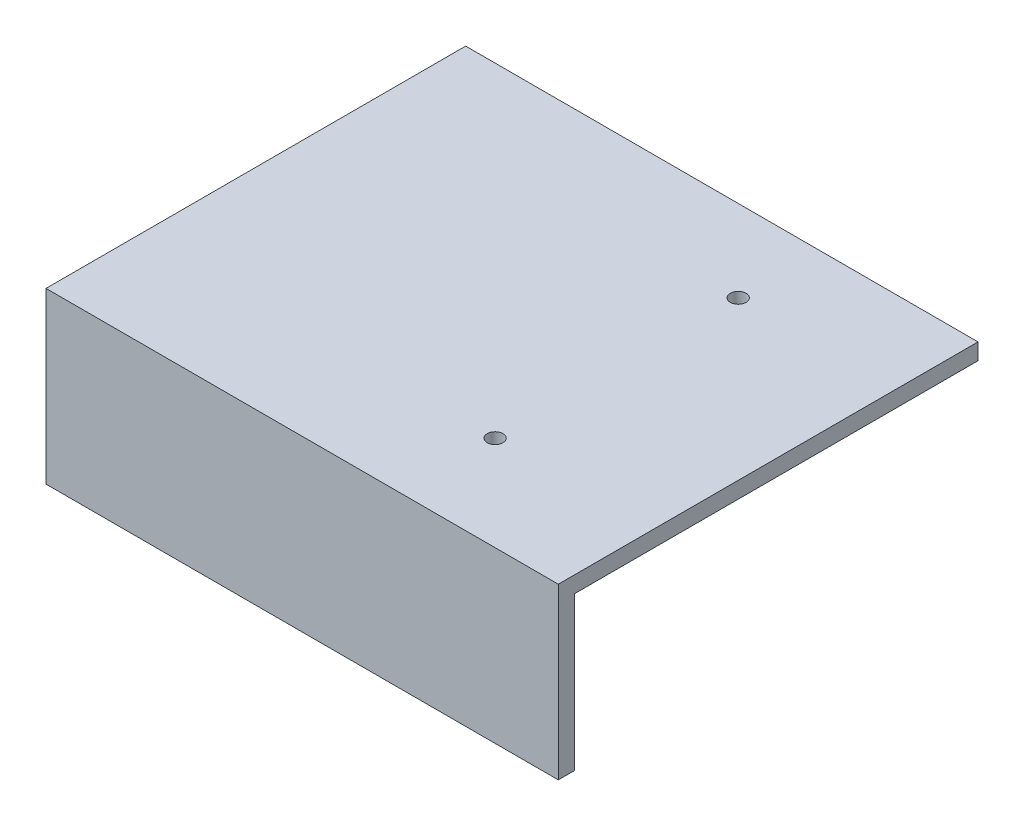
ISO-10303-21;
HEADER;
FILE_DESCRIPTION(('STEP AP214'),'2;1');
FILE_NAME('part.step','',(''),(''),'','','');
FILE_SCHEMA(('AUTOMOTIVE_DESIGN { 1 0 10303 214 1 1 1 1 }'));
ENDSEC;
DATA;
#1=APPLICATION_CONTEXT('core data for automotive mechanical design processes');
#2=APPLICATION_PROTOCOL_DEFINITION('international standard','automotive_design',2000,#1);
#3=PRODUCT_CONTEXT('',#1,'mechanical');
#4=PRODUCT('Part','Part','',(#3));
#5=PRODUCT_RELATED_PRODUCT_CATEGORY('part','',(#4));
#6=PRODUCT_DEFINITION_FORMATION('','',#4);
#7=PRODUCT_DEFINITION_CONTEXT('part definition',#1,'design');
#8=PRODUCT_DEFINITION('design','',#6,#7);
#9=PRODUCT_DEFINITION_SHAPE('','',#8);
#10=(LENGTH_UNIT() NAMED_UNIT(*) SI_UNIT(.MILLI.,.METRE.));
#11=(NAMED_UNIT(*) PLANE_ANGLE_UNIT() SI_UNIT($,.RADIAN.));
#12=(NAMED_UNIT(*) SI_UNIT($,.STERADIAN.) SOLID_ANGLE_UNIT());
#13=UNCERTAINTY_MEASURE_WITH_UNIT(LENGTH_MEASURE(1.E-05),#10,'distance_accuracy_value','');
#14=(GEOMETRIC_REPRESENTATION_CONTEXT(3) GLOBAL_UNCERTAINTY_ASSIGNED_CONTEXT((#13)) GLOBAL_UNIT_ASSIGNED_CONTEXT((#10,
#11,#12)) REPRESENTATION_CONTEXT('',''));
#15=CARTESIAN_POINT('',(0.,0.,0.));
#16=DIRECTION('',(0.,0.,1.));
#17=DIRECTION('',(1.,0.,0.));
#18=AXIS2_PLACEMENT_3D('',#15,#16,#17);
#19=CARTESIAN_POINT('',(47.,3.,38.5));
#20=DIRECTION('',(-1.,0.,0.));
#21=DIRECTION('',(0.,0.,1.));
#22=AXIS2_PLACEMENT_3D('',#19,#20,#21);
#23=PLANE('',#22);
#24=DIRECTION('',(0.,-1.,0.));
#25=VECTOR('',#24,1.);
#26=CARTESIAN_POINT('',(47.,3.,38.5));
#27=LINE('',#26,#25);
#28=CARTESIAN_POINT('',(47.,3.,38.5));
#29=VERTEX_POINT('',#28);
#30=CARTESIAN_POINT('',(47.,-28.1,38.5));
#31=VERTEX_POINT('',#30);
#32=EDGE_CURVE('E95',#29,#31,#27,.T.);
#33=ORIENTED_EDGE('',*,*,#32,.T.);
#34=DIRECTION('',(0.,0.,1.));
#35=VECTOR('',#34,1.);
#36=CARTESIAN_POINT('',(47.,-28.1,35.5));
#37=LINE('',#36,#35);
#38=CARTESIAN_POINT('',(47.,-28.1,35.5));
#39=VERTEX_POINT('',#38);
#40=EDGE_CURVE('E99',#39,#31,#37,.T.);
#41=ORIENTED_EDGE('',*,*,#40,.F.);
#42=DIRECTION('',(0.,1.,0.));
#43=VECTOR('',#42,1.);
#44=CARTESIAN_POINT('',(47.,-28.1,35.5));
#45=LINE('',#44,#43);
#46=CARTESIAN_POINT('',(47.,0.,35.5));
#47=VERTEX_POINT('',#46);
#48=EDGE_CURVE('E125',#39,#47,#45,.T.);
#49=ORIENTED_EDGE('',*,*,#48,.T.);
#50=DIRECTION('',(0.,0.,-1.));
#51=VECTOR('',#50,1.);
#52=CARTESIAN_POINT('',(47.,0.,38.5));
#53=LINE('',#52,#51);
#54=CARTESIAN_POINT('',(47.,0.,-38.5));
#55=VERTEX_POINT('',#54);
#56=EDGE_CURVE('E131',#47,#55,#53,.T.);
#57=ORIENTED_EDGE('',*,*,#56,.T.);
#58=DIRECTION('',(0.,-1.,0.));
#59=VECTOR('',#58,1.);
#60=CARTESIAN_POINT('',(47.,3.,-38.5));
#61=LINE('',#60,#59);
#62=CARTESIAN_POINT('',(47.,3.,-38.5));
#63=VERTEX_POINT('',#62);
#64=EDGE_CURVE('E11',#63,#55,#61,.T.);
#65=ORIENTED_EDGE('',*,*,#64,.F.);
#66=DIRECTION('',(0.,0.,-1.));
#67=VECTOR('',#66,1.);
#68=CARTESIAN_POINT('',(47.,3.,38.5));
#69=LINE('',#68,#67);
#70=EDGE_CURVE('E101',#29,#63,#69,.T.);
#71=ORIENTED_EDGE('',*,*,#70,.F.);
#72=EDGE_LOOP('',(#33,#41,#49,#57,#65,#71));
#73=FACE_BOUND('',#72,.T.);
#74=ADVANCED_FACE('F33',(#73),#23,.F.);
#75=CARTESIAN_POINT('',(-47.,3.,-38.5));
#76=DIRECTION('',(0.,0.,1.));
#77=DIRECTION('',(1.,0.,0.));
#78=AXIS2_PLACEMENT_3D('',#75,#76,#77);
#79=PLANE('',#78);
#80=DIRECTION('',(-1.,0.,0.));
#81=VECTOR('',#80,1.);
#82=CARTESIAN_POINT('',(-47.,0.,-38.5));
#83=LINE('',#82,#81);
#84=CARTESIAN_POINT('',(-47.,0.,-38.5));
#85=VERTEX_POINT('',#84);
#86=EDGE_CURVE('E73',#55,#85,#83,.T.);
#87=ORIENTED_EDGE('',*,*,#86,.T.);
#88=DIRECTION('',(0.,-1.,0.));
#89=VECTOR('',#88,1.);
#90=CARTESIAN_POINT('',(-47.,3.,-38.5));
#91=LINE('',#90,#89);
#92=CARTESIAN_POINT('',(-47.,3.,-38.5));
#93=VERTEX_POINT('',#92);
#94=EDGE_CURVE('E41',#93,#85,#91,.T.);
#95=ORIENTED_EDGE('',*,*,#94,.F.);
#96=DIRECTION('',(-1.,0.,0.));
#97=VECTOR('',#96,1.);
#98=CARTESIAN_POINT('',(-47.,3.,-38.5));
#99=LINE('',#98,#97);
#100=EDGE_CURVE('E78',#63,#93,#99,.T.);
#101=ORIENTED_EDGE('',*,*,#100,.F.);
#102=ORIENTED_EDGE('',*,*,#64,.T.);
#103=EDGE_LOOP('',(#87,#95,#101,#102));
#104=FACE_BOUND('',#103,.T.);
#105=ADVANCED_FACE('F162',(#104),#79,.F.);
#106=CARTESIAN_POINT('',(-47.,3.,38.5));
#107=DIRECTION('',(1.,0.,0.));
#108=DIRECTION('',(0.,0.,-1.));
#109=AXIS2_PLACEMENT_3D('',#106,#107,#108);
#110=PLANE('',#109);
#111=DIRECTION('',(0.,0.,1.));
#112=VECTOR('',#111,1.);
#113=CARTESIAN_POINT('',(-47.,0.,38.5));
#114=LINE('',#113,#112);
#115=CARTESIAN_POINT('',(-47.,0.,35.5));
#116=VERTEX_POINT('',#115);
#117=EDGE_CURVE('E133',#85,#116,#114,.T.);
#118=ORIENTED_EDGE('',*,*,#117,.T.);
#119=DIRECTION('',(0.,1.,0.));
#120=VECTOR('',#119,1.);
#121=CARTESIAN_POINT('',(-47.,-28.1,35.5));
#122=LINE('',#121,#120);
#123=CARTESIAN_POINT('',(-47.,-28.1,35.5));
#124=VERTEX_POINT('',#123);
#125=EDGE_CURVE('E128',#124,#116,#122,.T.);
#126=ORIENTED_EDGE('',*,*,#125,.F.);
#127=DIRECTION('',(0.,0.,-1.));
#128=VECTOR('',#127,1.);
#129=CARTESIAN_POINT('',(-47.,-28.1,35.5));
#130=LINE('',#129,#128);
#131=CARTESIAN_POINT('',(-47.,-28.1,38.5));
#132=VERTEX_POINT('',#131);
#133=EDGE_CURVE('E111',#132,#124,#130,.T.);
#134=ORIENTED_EDGE('',*,*,#133,.F.);
#135=DIRECTION('',(0.,-1.,0.));
#136=VECTOR('',#135,1.);
#137=CARTESIAN_POINT('',(-47.,3.,38.5));
#138=LINE('',#137,#136);
#139=CARTESIAN_POINT('',(-47.,3.,38.5));
#140=VERTEX_POINT('',#139);
#141=EDGE_CURVE('E103',#140,#132,#138,.T.);
#142=ORIENTED_EDGE('',*,*,#141,.F.);
#143=DIRECTION('',(0.,0.,1.));
#144=VECTOR('',#143,1.);
#145=CARTESIAN_POINT('',(-47.,3.,38.5));
#146=LINE('',#145,#144);
#147=EDGE_CURVE('E135',#93,#140,#146,.T.);
#148=ORIENTED_EDGE('',*,*,#147,.F.);
#149=ORIENTED_EDGE('',*,*,#94,.T.);
#150=EDGE_LOOP('',(#118,#126,#134,#142,#148,#149));
#151=FACE_BOUND('',#150,.T.);
#152=ADVANCED_FACE('F164',(#151),#110,.F.);
#153=CARTESIAN_POINT('',(-47.,3.,38.5));
#154=DIRECTION('',(0.,0.,-1.));
#155=DIRECTION('',(-1.,0.,0.));
#156=AXIS2_PLACEMENT_3D('',#153,#154,#155);
#157=PLANE('',#156);
#158=ORIENTED_EDGE('',*,*,#141,.T.);
#159=DIRECTION('',(-1.,0.,0.));
#160=VECTOR('',#159,1.);
#161=CARTESIAN_POINT('',(-47.,-28.1,38.5));
#162=LINE('',#161,#160);
#163=EDGE_CURVE('E106',#31,#132,#162,.T.);
#164=ORIENTED_EDGE('',*,*,#163,.F.);
#165=ORIENTED_EDGE('',*,*,#32,.F.);
#166=DIRECTION('',(1.,0.,0.));
#167=VECTOR('',#166,1.);
#168=CARTESIAN_POINT('',(-47.,3.,38.5));
#169=LINE('',#168,#167);
#170=EDGE_CURVE('E58',#140,#29,#169,.T.);
#171=ORIENTED_EDGE('',*,*,#170,.F.);
#172=EDGE_LOOP('',(#158,#164,#165,#171));
#173=FACE_BOUND('',#172,.T.);
#174=ADVANCED_FACE('F107',(#173),#157,.F.);
#175=CARTESIAN_POINT('',(0.,3.,0.));
#176=DIRECTION('',(0.,-1.,0.));
#177=DIRECTION('',(0.,0.,-1.));
#178=AXIS2_PLACEMENT_3D('',#175,#176,#177);
#179=PLANE('',#178);
#180=CARTESIAN_POINT('',(18.,3.,21.1));
#181=DIRECTION('',(0.,1.,0.));
#182=DIRECTION('',(0.,0.,1.));
#183=AXIS2_PLACEMENT_3D('',#180,#181,#182);
#184=CIRCLE('',#183,1.45);
#185=CARTESIAN_POINT('',(18.,3.,22.55));
#186=VERTEX_POINT('',#185);
#187=EDGE_CURVE('E149',#186,#186,#184,.T.);
#188=ORIENTED_EDGE('',*,*,#187,.F.);
#189=EDGE_LOOP('',(#188));
#190=FACE_BOUND('',#189,.T.);
#191=CARTESIAN_POINT('',(18.,3.,-23.5));
#192=DIRECTION('',(0.,1.,0.));
#193=DIRECTION('',(0.,0.,1.));
#194=AXIS2_PLACEMENT_3D('',#191,#192,#193);
#195=CIRCLE('',#194,1.45);
#196=CARTESIAN_POINT('',(18.,3.,-22.05));
#197=VERTEX_POINT('',#196);
#198=EDGE_CURVE('E121',#197,#197,#195,.T.);
#199=ORIENTED_EDGE('',*,*,#198,.F.);
#200=EDGE_LOOP('',(#199));
#201=FACE_BOUND('',#200,.T.);
#202=ORIENTED_EDGE('',*,*,#70,.T.);
#203=ORIENTED_EDGE('',*,*,#100,.T.);
#204=ORIENTED_EDGE('',*,*,#147,.T.);
#205=ORIENTED_EDGE('',*,*,#170,.T.);
#206=EDGE_LOOP('',(#202,#203,#204,#205));
#207=FACE_BOUND('',#206,.T.);
#208=ADVANCED_FACE('F157',(#190,#201,#207),#179,.F.);
#209=CARTESIAN_POINT('',(0.,0.,0.));
#210=DIRECTION('',(0.,-1.,0.));
#211=DIRECTION('',(0.,0.,-1.));
#212=AXIS2_PLACEMENT_3D('',#209,#210,#211);
#213=PLANE('',#212);
#214=CARTESIAN_POINT('',(18.,0.,21.1));
#215=DIRECTION('',(0.,-1.,0.));
#216=DIRECTION('',(0.,0.,-1.));
#217=AXIS2_PLACEMENT_3D('',#214,#215,#216);
#218=CIRCLE('',#217,1.45);
#219=CARTESIAN_POINT('',(18.,0.,19.65));
#220=VERTEX_POINT('',#219);
#221=EDGE_CURVE('E36',#220,#220,#218,.T.);
#222=ORIENTED_EDGE('',*,*,#221,.F.);
#223=EDGE_LOOP('',(#222));
#224=FACE_BOUND('',#223,.T.);
#225=CARTESIAN_POINT('',(18.,0.,-23.5));
#226=DIRECTION('',(0.,-1.,0.));
#227=DIRECTION('',(0.,0.,-1.));
#228=AXIS2_PLACEMENT_3D('',#225,#226,#227);
#229=CIRCLE('',#228,1.45);
#230=CARTESIAN_POINT('',(18.,0.,-24.95));
#231=VERTEX_POINT('',#230);
#232=EDGE_CURVE('E118',#231,#231,#229,.T.);
#233=ORIENTED_EDGE('',*,*,#232,.F.);
#234=EDGE_LOOP('',(#233));
#235=FACE_BOUND('',#234,.T.);
#236=DIRECTION('',(1.,0.,0.));
#237=VECTOR('',#236,1.);
#238=CARTESIAN_POINT('',(-47.,0.,35.5));
#239=LINE('',#238,#237);
#240=EDGE_CURVE('E49',#116,#47,#239,.T.);
#241=ORIENTED_EDGE('',*,*,#240,.F.);
#242=ORIENTED_EDGE('',*,*,#117,.F.);
#243=ORIENTED_EDGE('',*,*,#86,.F.);
#244=ORIENTED_EDGE('',*,*,#56,.F.);
#245=EDGE_LOOP('',(#241,#242,#243,#244));
#246=FACE_BOUND('',#245,.T.);
#247=ADVANCED_FACE('F160',(#224,#235,#246),#213,.T.);
#248=CARTESIAN_POINT('',(-47.,-28.1,35.5));
#249=DIRECTION('',(0.,0.,1.));
#250=DIRECTION('',(1.,0.,0.));
#251=AXIS2_PLACEMENT_3D('',#248,#249,#250);
#252=PLANE('',#251);
#253=ORIENTED_EDGE('',*,*,#240,.T.);
#254=ORIENTED_EDGE('',*,*,#48,.F.);
#255=DIRECTION('',(1.,0.,0.));
#256=VECTOR('',#255,1.);
#257=CARTESIAN_POINT('',(-47.,-28.1,35.5));
#258=LINE('',#257,#256);
#259=EDGE_CURVE('E115',#124,#39,#258,.T.);
#260=ORIENTED_EDGE('',*,*,#259,.F.);
#261=ORIENTED_EDGE('',*,*,#125,.T.);
#262=EDGE_LOOP('',(#253,#254,#260,#261));
#263=FACE_BOUND('',#262,.T.);
#264=ADVANCED_FACE('F175',(#263),#252,.F.);
#265=CARTESIAN_POINT('',(0.,-28.1,0.));
#266=DIRECTION('',(0.,1.,0.));
#267=DIRECTION('',(0.,0.,1.));
#268=AXIS2_PLACEMENT_3D('',#265,#266,#267);
#269=PLANE('',#268);
#270=ORIENTED_EDGE('',*,*,#40,.T.);
#271=ORIENTED_EDGE('',*,*,#163,.T.);
#272=ORIENTED_EDGE('',*,*,#133,.T.);
#273=ORIENTED_EDGE('',*,*,#259,.T.);
#274=EDGE_LOOP('',(#270,#271,#272,#273));
#275=FACE_BOUND('',#274,.T.);
#276=ADVANCED_FACE('F113',(#275),#269,.F.);
#277=CARTESIAN_POINT('',(18.,-28.1,-23.5));
#278=DIRECTION('',(0.,1.,0.));
#279=DIRECTION('',(0.,0.,1.));
#280=AXIS2_PLACEMENT_3D('',#277,#278,#279);
#281=CYLINDRICAL_SURFACE('',#280,1.45);
#282=ORIENTED_EDGE('',*,*,#232,.T.);
#283=EDGE_LOOP('',(#282));
#284=FACE_BOUND('',#283,.T.);
#285=ORIENTED_EDGE('',*,*,#198,.T.);
#286=EDGE_LOOP('',(#285));
#287=FACE_BOUND('',#286,.T.);
#288=ADVANCED_FACE('F183',(#284,#287),#281,.F.);
#289=CARTESIAN_POINT('',(18.,-28.1,21.1));
#290=DIRECTION('',(0.,1.,0.));
#291=DIRECTION('',(0.,0.,1.));
#292=AXIS2_PLACEMENT_3D('',#289,#290,#291);
#293=CYLINDRICAL_SURFACE('',#292,1.45);
#294=ORIENTED_EDGE('',*,*,#221,.T.);
#295=EDGE_LOOP('',(#294));
#296=FACE_BOUND('',#295,.T.);
#297=ORIENTED_EDGE('',*,*,#187,.T.);
#298=EDGE_LOOP('',(#297));
#299=FACE_BOUND('',#298,.T.);
#300=ADVANCED_FACE('F155',(#296,#299),#293,.F.);
#301=CLOSED_SHELL('',(#74,#105,#152,#174,#208,#247,#264,#276,#288,#300));
#302=MANIFOLD_SOLID_BREP('B2',#301);
#303=ADVANCED_BREP_SHAPE_REPRESENTATION('',(#18,#302),#14);
#304=SHAPE_DEFINITION_REPRESENTATION(#9,#303);
ENDSEC;
END-ISO-10303-21;
